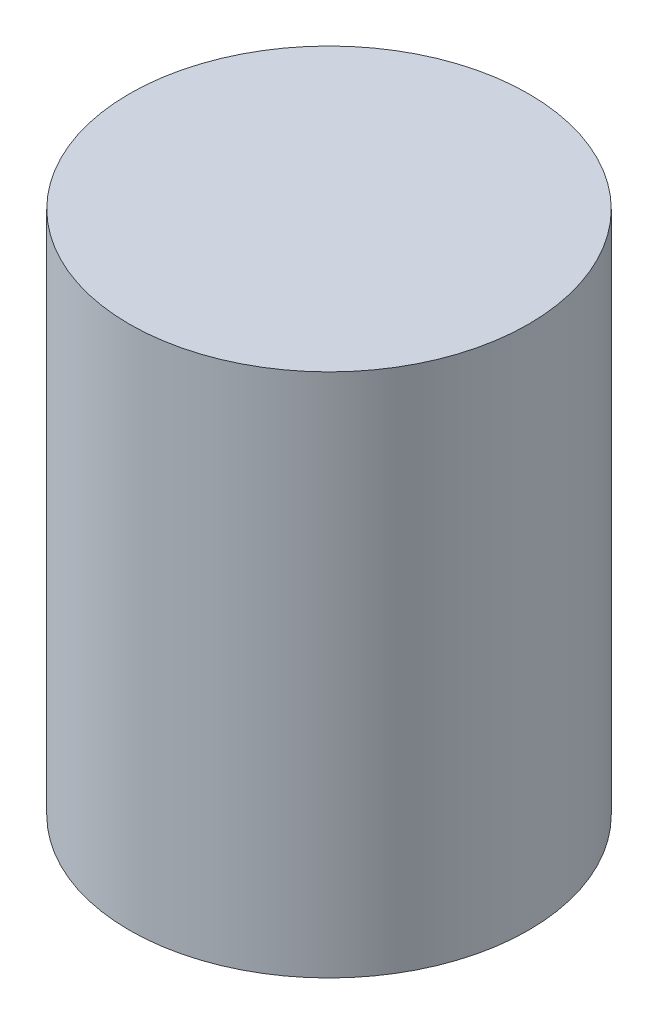
ISO-10303-21;
HEADER;
FILE_DESCRIPTION(('STEP AP214'),'2;1');
FILE_NAME('part.step','',(''),(''),'','','');
FILE_SCHEMA(('AUTOMOTIVE_DESIGN { 1 0 10303 214 1 1 1 1 }'));
ENDSEC;
DATA;
#1=APPLICATION_CONTEXT('core data for automotive mechanical design processes');
#2=APPLICATION_PROTOCOL_DEFINITION('international standard','automotive_design',2000,#1);
#3=PRODUCT_CONTEXT('',#1,'mechanical');
#4=PRODUCT('Part','Part','',(#3));
#5=PRODUCT_RELATED_PRODUCT_CATEGORY('part','',(#4));
#6=PRODUCT_DEFINITION_FORMATION('','',#4);
#7=PRODUCT_DEFINITION_CONTEXT('part definition',#1,'design');
#8=PRODUCT_DEFINITION('design','',#6,#7);
#9=PRODUCT_DEFINITION_SHAPE('','',#8);
#10=(LENGTH_UNIT() NAMED_UNIT(*) SI_UNIT(.MILLI.,.METRE.));
#11=(NAMED_UNIT(*) PLANE_ANGLE_UNIT() SI_UNIT($,.RADIAN.));
#12=(NAMED_UNIT(*) SI_UNIT($,.STERADIAN.) SOLID_ANGLE_UNIT());
#13=UNCERTAINTY_MEASURE_WITH_UNIT(LENGTH_MEASURE(1.E-05),#10,'distance_accuracy_value','');
#14=(GEOMETRIC_REPRESENTATION_CONTEXT(3) GLOBAL_UNCERTAINTY_ASSIGNED_CONTEXT((#13)) GLOBAL_UNIT_ASSIGNED_CONTEXT((#10,
#11,#12)) REPRESENTATION_CONTEXT('',''));
#15=CARTESIAN_POINT('',(0.,0.,0.));
#16=DIRECTION('',(0.,0.,1.));
#17=DIRECTION('',(1.,0.,0.));
#18=AXIS2_PLACEMENT_3D('',#15,#16,#17);
#19=CARTESIAN_POINT('',(0.,8.349999936,0.));
#20=DIRECTION('',(0.,-1.,0.));
#21=DIRECTION('',(0.,0.,-1.));
#22=AXIS2_PLACEMENT_3D('',#19,#20,#21);
#23=CYLINDRICAL_SURFACE('',#22,3.175);
#24=CARTESIAN_POINT('',(0.,8.349999936,0.));
#25=DIRECTION('',(0.,1.,0.));
#26=DIRECTION('',(0.,0.,1.));
#27=AXIS2_PLACEMENT_3D('',#24,#25,#26);
#28=CIRCLE('',#27,3.175);
#29=CARTESIAN_POINT('',(0.,8.349999936,3.175));
#30=VERTEX_POINT('',#29);
#31=EDGE_CURVE('E10',#30,#30,#28,.T.);
#32=ORIENTED_EDGE('',*,*,#31,.F.);
#33=EDGE_LOOP('',(#32));
#34=FACE_BOUND('',#33,.T.);
#35=CARTESIAN_POINT('',(0.,0.,0.));
#36=DIRECTION('',(0.,1.,0.));
#37=DIRECTION('',(0.,0.,1.));
#38=AXIS2_PLACEMENT_3D('',#35,#36,#37);
#39=CIRCLE('',#38,3.175);
#40=CARTESIAN_POINT('',(0.,0.,3.175));
#41=VERTEX_POINT('',#40);
#42=EDGE_CURVE('E36',#41,#41,#39,.T.);
#43=ORIENTED_EDGE('',*,*,#42,.T.);
#44=EDGE_LOOP('',(#43));
#45=FACE_BOUND('',#44,.T.);
#46=ADVANCED_FACE('F33',(#34,#45),#23,.T.);
#47=CARTESIAN_POINT('',(0.,8.349999936,0.));
#48=DIRECTION('',(0.,1.,0.));
#49=DIRECTION('',(0.,0.,1.));
#50=AXIS2_PLACEMENT_3D('',#47,#48,#49);
#51=PLANE('',#50);
#52=ORIENTED_EDGE('',*,*,#31,.T.);
#53=EDGE_LOOP('',(#52));
#54=FACE_BOUND('',#53,.T.);
#55=ADVANCED_FACE('F48',(#54),#51,.T.);
#56=CARTESIAN_POINT('',(0.,0.,0.));
#57=DIRECTION('',(0.,1.,0.));
#58=DIRECTION('',(0.,0.,1.));
#59=AXIS2_PLACEMENT_3D('',#56,#57,#58);
#60=PLANE('',#59);
#61=ORIENTED_EDGE('',*,*,#42,.F.);
#62=EDGE_LOOP('',(#61));
#63=FACE_BOUND('',#62,.T.);
#64=ADVANCED_FACE('F46',(#63),#60,.F.);
#65=CLOSED_SHELL('',(#46,#55,#64));
#66=MANIFOLD_SOLID_BREP('B2',#65);
#67=ADVANCED_BREP_SHAPE_REPRESENTATION('',(#18,#66),#14);
#68=SHAPE_DEFINITION_REPRESENTATION(#9,#67);
ENDSEC;
END-ISO-10303-21;
